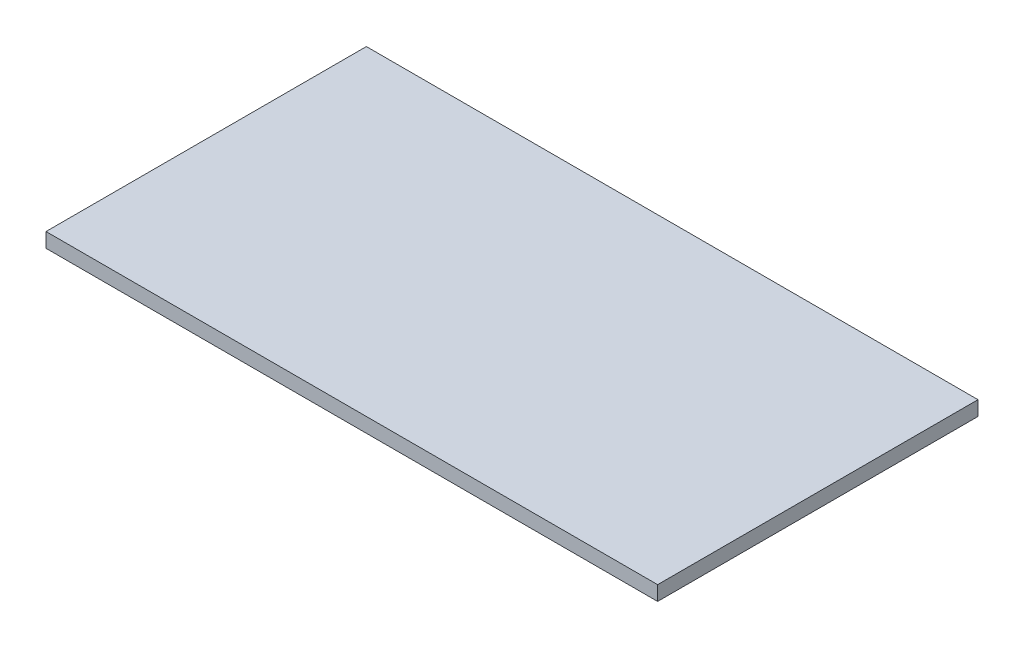
ISO-10303-21;
HEADER;
FILE_DESCRIPTION(('STEP AP214'),'2;1');
FILE_NAME('part.step','',(''),(''),'','','');
FILE_SCHEMA(('AUTOMOTIVE_DESIGN { 1 0 10303 214 1 1 1 1 }'));
ENDSEC;
DATA;
#1=APPLICATION_CONTEXT('core data for automotive mechanical design processes');
#2=APPLICATION_PROTOCOL_DEFINITION('international standard','automotive_design',2000,#1);
#3=PRODUCT_CONTEXT('',#1,'mechanical');
#4=PRODUCT('Part','Part','',(#3));
#5=PRODUCT_RELATED_PRODUCT_CATEGORY('part','',(#4));
#6=PRODUCT_DEFINITION_FORMATION('','',#4);
#7=PRODUCT_DEFINITION_CONTEXT('part definition',#1,'design');
#8=PRODUCT_DEFINITION('design','',#6,#7);
#9=PRODUCT_DEFINITION_SHAPE('','',#8);
#10=(LENGTH_UNIT() NAMED_UNIT(*) SI_UNIT(.MILLI.,.METRE.));
#11=(NAMED_UNIT(*) PLANE_ANGLE_UNIT() SI_UNIT($,.RADIAN.));
#12=(NAMED_UNIT(*) SI_UNIT($,.STERADIAN.) SOLID_ANGLE_UNIT());
#13=UNCERTAINTY_MEASURE_WITH_UNIT(LENGTH_MEASURE(1.E-05),#10,'distance_accuracy_value','');
#14=(GEOMETRIC_REPRESENTATION_CONTEXT(3) GLOBAL_UNCERTAINTY_ASSIGNED_CONTEXT((#13)) GLOBAL_UNIT_ASSIGNED_CONTEXT((#10,
#11,#12)) REPRESENTATION_CONTEXT('',''));
#15=CARTESIAN_POINT('',(0.,0.,0.));
#16=DIRECTION('',(0.,0.,1.));
#17=DIRECTION('',(1.,0.,0.));
#18=AXIS2_PLACEMENT_3D('',#15,#16,#17);
#19=CARTESIAN_POINT('',(0.,12.7,-279.4));
#20=DIRECTION('',(1.,0.,0.));
#21=DIRECTION('',(0.,0.,-1.));
#22=AXIS2_PLACEMENT_3D('',#19,#20,#21);
#23=PLANE('',#22);
#24=DIRECTION('',(0.,0.,1.));
#25=VECTOR('',#24,1.);
#26=CARTESIAN_POINT('',(0.,0.,-279.4));
#27=LINE('',#26,#25);
#28=CARTESIAN_POINT('',(0.,0.,-279.4));
#29=VERTEX_POINT('',#28);
#30=CARTESIAN_POINT('',(0.,0.,0.));
#31=VERTEX_POINT('',#30);
#32=EDGE_CURVE('E98',#29,#31,#27,.T.);
#33=ORIENTED_EDGE('',*,*,#32,.T.);
#34=DIRECTION('',(0.,-1.,0.));
#35=VECTOR('',#34,1.);
#36=CARTESIAN_POINT('',(0.,12.7,0.));
#37=LINE('',#36,#35);
#38=CARTESIAN_POINT('',(0.,12.7,0.));
#39=VERTEX_POINT('',#38);
#40=EDGE_CURVE('E11',#39,#31,#37,.T.);
#41=ORIENTED_EDGE('',*,*,#40,.F.);
#42=DIRECTION('',(0.,0.,1.));
#43=VECTOR('',#42,1.);
#44=CARTESIAN_POINT('',(0.,12.7,-279.4));
#45=LINE('',#44,#43);
#46=CARTESIAN_POINT('',(0.,12.7,-279.4));
#47=VERTEX_POINT('',#46);
#48=EDGE_CURVE('E86',#47,#39,#45,.T.);
#49=ORIENTED_EDGE('',*,*,#48,.F.);
#50=DIRECTION('',(0.,-1.,0.));
#51=VECTOR('',#50,1.);
#52=CARTESIAN_POINT('',(0.,12.7,-279.4));
#53=LINE('',#52,#51);
#54=EDGE_CURVE('E94',#47,#29,#53,.T.);
#55=ORIENTED_EDGE('',*,*,#54,.T.);
#56=EDGE_LOOP('',(#33,#41,#49,#55));
#57=FACE_BOUND('',#56,.T.);
#58=ADVANCED_FACE('F35',(#57),#23,.F.);
#59=CARTESIAN_POINT('',(0.,12.7,0.));
#60=DIRECTION('',(0.,0.,-1.));
#61=DIRECTION('',(-1.,0.,0.));
#62=AXIS2_PLACEMENT_3D('',#59,#60,#61);
#63=PLANE('',#62);
#64=DIRECTION('',(1.,0.,0.));
#65=VECTOR('',#64,1.);
#66=CARTESIAN_POINT('',(0.,0.,0.));
#67=LINE('',#66,#65);
#68=CARTESIAN_POINT('',(533.4,0.,0.));
#69=VERTEX_POINT('',#68);
#70=EDGE_CURVE('E90',#31,#69,#67,.T.);
#71=ORIENTED_EDGE('',*,*,#70,.T.);
#72=DIRECTION('',(0.,-1.,0.));
#73=VECTOR('',#72,1.);
#74=CARTESIAN_POINT('',(533.4,12.7,0.));
#75=LINE('',#74,#73);
#76=CARTESIAN_POINT('',(533.4,12.7,0.));
#77=VERTEX_POINT('',#76);
#78=EDGE_CURVE('E43',#77,#69,#75,.T.);
#79=ORIENTED_EDGE('',*,*,#78,.F.);
#80=DIRECTION('',(1.,0.,0.));
#81=VECTOR('',#80,1.);
#82=CARTESIAN_POINT('',(0.,12.7,0.));
#83=LINE('',#82,#81);
#84=EDGE_CURVE('E81',#39,#77,#83,.T.);
#85=ORIENTED_EDGE('',*,*,#84,.F.);
#86=ORIENTED_EDGE('',*,*,#40,.T.);
#87=EDGE_LOOP('',(#71,#79,#85,#86));
#88=FACE_BOUND('',#87,.T.);
#89=ADVANCED_FACE('F89',(#88),#63,.F.);
#90=CARTESIAN_POINT('',(533.4,12.7,-279.4));
#91=DIRECTION('',(-1.,0.,0.));
#92=DIRECTION('',(0.,0.,1.));
#93=AXIS2_PLACEMENT_3D('',#90,#91,#92);
#94=PLANE('',#93);
#95=DIRECTION('',(0.,0.,-1.));
#96=VECTOR('',#95,1.);
#97=CARTESIAN_POINT('',(533.4,0.,-279.4));
#98=LINE('',#97,#96);
#99=CARTESIAN_POINT('',(533.4,0.,-279.4));
#100=VERTEX_POINT('',#99);
#101=EDGE_CURVE('E68',#69,#100,#98,.T.);
#102=ORIENTED_EDGE('',*,*,#101,.T.);
#103=DIRECTION('',(0.,-1.,0.));
#104=VECTOR('',#103,1.);
#105=CARTESIAN_POINT('',(533.4,12.7,-279.4));
#106=LINE('',#105,#104);
#107=CARTESIAN_POINT('',(533.4,12.7,-279.4));
#108=VERTEX_POINT('',#107);
#109=EDGE_CURVE('E91',#108,#100,#106,.T.);
#110=ORIENTED_EDGE('',*,*,#109,.F.);
#111=DIRECTION('',(0.,0.,-1.));
#112=VECTOR('',#111,1.);
#113=CARTESIAN_POINT('',(533.4,12.7,-279.4));
#114=LINE('',#113,#112);
#115=EDGE_CURVE('E84',#77,#108,#114,.T.);
#116=ORIENTED_EDGE('',*,*,#115,.F.);
#117=ORIENTED_EDGE('',*,*,#78,.T.);
#118=EDGE_LOOP('',(#102,#110,#116,#117));
#119=FACE_BOUND('',#118,.T.);
#120=ADVANCED_FACE('F92',(#119),#94,.F.);
#121=CARTESIAN_POINT('',(0.,12.7,-279.4));
#122=DIRECTION('',(0.,0.,1.));
#123=DIRECTION('',(1.,0.,0.));
#124=AXIS2_PLACEMENT_3D('',#121,#122,#123);
#125=PLANE('',#124);
#126=DIRECTION('',(-1.,0.,0.));
#127=VECTOR('',#126,1.);
#128=CARTESIAN_POINT('',(0.,0.,-279.4));
#129=LINE('',#128,#127);
#130=EDGE_CURVE('E74',#100,#29,#129,.T.);
#131=ORIENTED_EDGE('',*,*,#130,.T.);
#132=ORIENTED_EDGE('',*,*,#54,.F.);
#133=DIRECTION('',(-1.,0.,0.));
#134=VECTOR('',#133,1.);
#135=CARTESIAN_POINT('',(0.,12.7,-279.4));
#136=LINE('',#135,#134);
#137=EDGE_CURVE('E51',#108,#47,#136,.T.);
#138=ORIENTED_EDGE('',*,*,#137,.F.);
#139=ORIENTED_EDGE('',*,*,#109,.T.);
#140=EDGE_LOOP('',(#131,#132,#138,#139));
#141=FACE_BOUND('',#140,.T.);
#142=ADVANCED_FACE('F105',(#141),#125,.F.);
#143=CARTESIAN_POINT('',(0.,12.7,0.));
#144=DIRECTION('',(0.,1.,0.));
#145=DIRECTION('',(0.,0.,1.));
#146=AXIS2_PLACEMENT_3D('',#143,#144,#145);
#147=PLANE('',#146);
#148=ORIENTED_EDGE('',*,*,#48,.T.);
#149=ORIENTED_EDGE('',*,*,#84,.T.);
#150=ORIENTED_EDGE('',*,*,#115,.T.);
#151=ORIENTED_EDGE('',*,*,#137,.T.);
#152=EDGE_LOOP('',(#148,#149,#150,#151));
#153=FACE_BOUND('',#152,.T.);
#154=ADVANCED_FACE('F82',(#153),#147,.T.);
#155=CARTESIAN_POINT('',(0.,0.,0.));
#156=DIRECTION('',(0.,1.,0.));
#157=DIRECTION('',(0.,0.,1.));
#158=AXIS2_PLACEMENT_3D('',#155,#156,#157);
#159=PLANE('',#158);
#160=ORIENTED_EDGE('',*,*,#32,.F.);
#161=ORIENTED_EDGE('',*,*,#130,.F.);
#162=ORIENTED_EDGE('',*,*,#101,.F.);
#163=ORIENTED_EDGE('',*,*,#70,.F.);
#164=EDGE_LOOP('',(#160,#161,#162,#163));
#165=FACE_BOUND('',#164,.T.);
#166=ADVANCED_FACE('F108',(#165),#159,.F.);
#167=CLOSED_SHELL('',(#58,#89,#120,#142,#154,#166));
#168=MANIFOLD_SOLID_BREP('B2',#167);
#169=ADVANCED_BREP_SHAPE_REPRESENTATION('',(#18,#168),#14);
#170=SHAPE_DEFINITION_REPRESENTATION(#9,#169);
ENDSEC;
END-ISO-10303-21;
